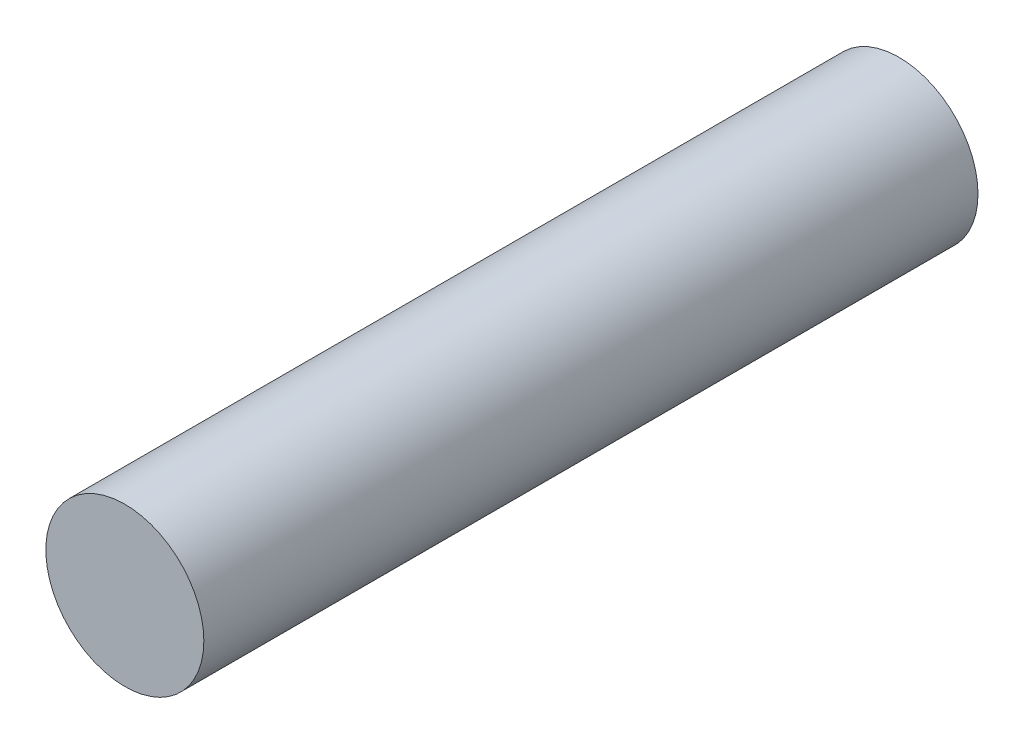
ISO-10303-21;
HEADER;
FILE_DESCRIPTION(('STEP AP214'),'2;1');
FILE_NAME('part.step','',(''),(''),'','','');
FILE_SCHEMA(('AUTOMOTIVE_DESIGN { 1 0 10303 214 1 1 1 1 }'));
ENDSEC;
DATA;
#1=APPLICATION_CONTEXT('core data for automotive mechanical design processes');
#2=APPLICATION_PROTOCOL_DEFINITION('international standard','automotive_design',2000,#1);
#3=PRODUCT_CONTEXT('',#1,'mechanical');
#4=PRODUCT('Part','Part','',(#3));
#5=PRODUCT_RELATED_PRODUCT_CATEGORY('part','',(#4));
#6=PRODUCT_DEFINITION_FORMATION('','',#4);
#7=PRODUCT_DEFINITION_CONTEXT('part definition',#1,'design');
#8=PRODUCT_DEFINITION('design','',#6,#7);
#9=PRODUCT_DEFINITION_SHAPE('','',#8);
#10=(LENGTH_UNIT() NAMED_UNIT(*) SI_UNIT(.MILLI.,.METRE.));
#11=(NAMED_UNIT(*) PLANE_ANGLE_UNIT() SI_UNIT($,.RADIAN.));
#12=(NAMED_UNIT(*) SI_UNIT($,.STERADIAN.) SOLID_ANGLE_UNIT());
#13=UNCERTAINTY_MEASURE_WITH_UNIT(LENGTH_MEASURE(1.E-05),#10,'distance_accuracy_value','');
#14=(GEOMETRIC_REPRESENTATION_CONTEXT(3) GLOBAL_UNCERTAINTY_ASSIGNED_CONTEXT((#13)) GLOBAL_UNIT_ASSIGNED_CONTEXT((#10,
#11,#12)) REPRESENTATION_CONTEXT('',''));
#15=CARTESIAN_POINT('',(0.,0.,0.));
#16=DIRECTION('',(0.,0.,1.));
#17=DIRECTION('',(1.,0.,0.));
#18=AXIS2_PLACEMENT_3D('',#15,#16,#17);
#19=CARTESIAN_POINT('',(0.,0.,49.));
#20=DIRECTION('',(0.,0.,-1.));
#21=DIRECTION('',(-1.,0.,0.));
#22=AXIS2_PLACEMENT_3D('',#19,#20,#21);
#23=CYLINDRICAL_SURFACE('',#22,5.);
#24=CARTESIAN_POINT('',(0.,0.,49.));
#25=DIRECTION('',(0.,0.,1.));
#26=DIRECTION('',(1.,0.,0.));
#27=AXIS2_PLACEMENT_3D('',#24,#25,#26);
#28=CIRCLE('',#27,5.);
#29=CARTESIAN_POINT('',(5.,0.,49.));
#30=VERTEX_POINT('',#29);
#31=EDGE_CURVE('E10',#30,#30,#28,.T.);
#32=ORIENTED_EDGE('',*,*,#31,.F.);
#33=EDGE_LOOP('',(#32));
#34=FACE_BOUND('',#33,.T.);
#35=CARTESIAN_POINT('',(0.,0.,0.));
#36=DIRECTION('',(0.,0.,1.));
#37=DIRECTION('',(1.,0.,0.));
#38=AXIS2_PLACEMENT_3D('',#35,#36,#37);
#39=CIRCLE('',#38,5.);
#40=CARTESIAN_POINT('',(5.,0.,0.));
#41=VERTEX_POINT('',#40);
#42=EDGE_CURVE('E38',#41,#41,#39,.T.);
#43=ORIENTED_EDGE('',*,*,#42,.T.);
#44=EDGE_LOOP('',(#43));
#45=FACE_BOUND('',#44,.T.);
#46=ADVANCED_FACE('F35',(#34,#45),#23,.T.);
#47=CARTESIAN_POINT('',(0.,0.,49.));
#48=DIRECTION('',(0.,0.,1.));
#49=DIRECTION('',(1.,0.,0.));
#50=AXIS2_PLACEMENT_3D('',#47,#48,#49);
#51=PLANE('',#50);
#52=ORIENTED_EDGE('',*,*,#31,.T.);
#53=EDGE_LOOP('',(#52));
#54=FACE_BOUND('',#53,.T.);
#55=ADVANCED_FACE('F50',(#54),#51,.T.);
#56=CARTESIAN_POINT('',(0.,0.,0.));
#57=DIRECTION('',(0.,0.,1.));
#58=DIRECTION('',(1.,0.,0.));
#59=AXIS2_PLACEMENT_3D('',#56,#57,#58);
#60=PLANE('',#59);
#61=ORIENTED_EDGE('',*,*,#42,.F.);
#62=EDGE_LOOP('',(#61));
#63=FACE_BOUND('',#62,.T.);
#64=ADVANCED_FACE('F48',(#63),#60,.F.);
#65=CLOSED_SHELL('',(#46,#55,#64));
#66=MANIFOLD_SOLID_BREP('B2',#65);
#67=ADVANCED_BREP_SHAPE_REPRESENTATION('',(#18,#66),#14);
#68=SHAPE_DEFINITION_REPRESENTATION(#9,#67);
ENDSEC;
END-ISO-10303-21;
